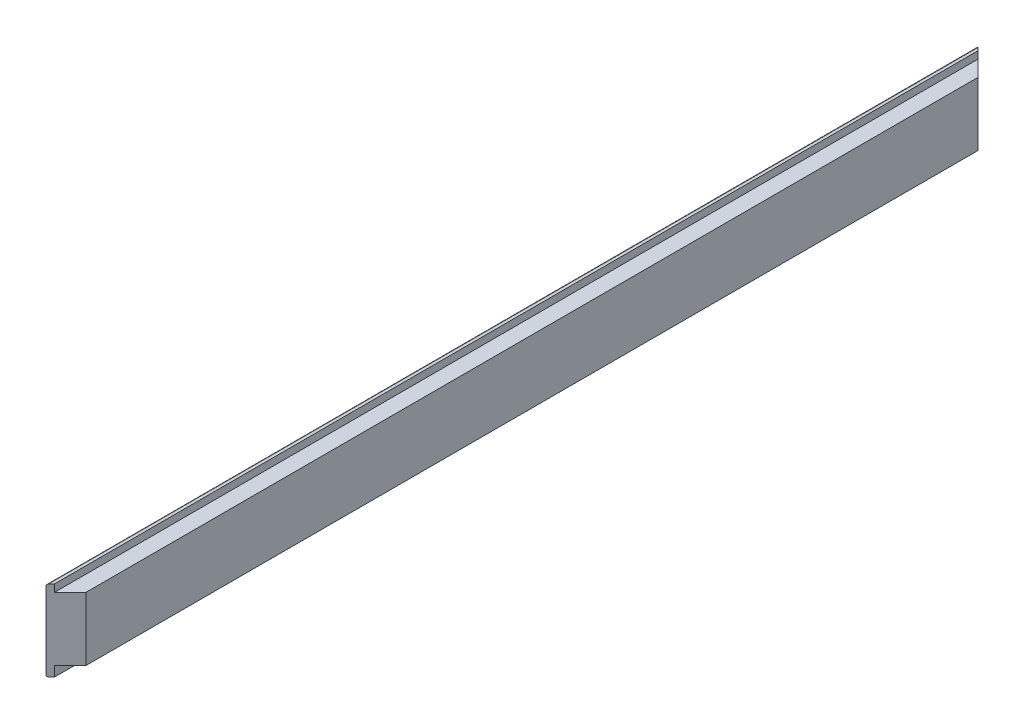
ISO-10303-21;
HEADER;
FILE_DESCRIPTION(('STEP AP214'),'2;1');
FILE_NAME('part.step','',(''),(''),'','','');
FILE_SCHEMA(('AUTOMOTIVE_DESIGN { 1 0 10303 214 1 1 1 1 }'));
ENDSEC;
DATA;
#1=APPLICATION_CONTEXT('core data for automotive mechanical design processes');
#2=APPLICATION_PROTOCOL_DEFINITION('international standard','automotive_design',2000,#1);
#3=PRODUCT_CONTEXT('',#1,'mechanical');
#4=PRODUCT('Part','Part','',(#3));
#5=PRODUCT_RELATED_PRODUCT_CATEGORY('part','',(#4));
#6=PRODUCT_DEFINITION_FORMATION('','',#4);
#7=PRODUCT_DEFINITION_CONTEXT('part definition',#1,'design');
#8=PRODUCT_DEFINITION('design','',#6,#7);
#9=PRODUCT_DEFINITION_SHAPE('','',#8);
#10=(LENGTH_UNIT() NAMED_UNIT(*) SI_UNIT(.MILLI.,.METRE.));
#11=(NAMED_UNIT(*) PLANE_ANGLE_UNIT() SI_UNIT($,.RADIAN.));
#12=(NAMED_UNIT(*) SI_UNIT($,.STERADIAN.) SOLID_ANGLE_UNIT());
#13=UNCERTAINTY_MEASURE_WITH_UNIT(LENGTH_MEASURE(1.E-05),#10,'distance_accuracy_value','');
#14=(GEOMETRIC_REPRESENTATION_CONTEXT(3) GLOBAL_UNCERTAINTY_ASSIGNED_CONTEXT((#13)) GLOBAL_UNIT_ASSIGNED_CONTEXT((#10,
#11,#12)) REPRESENTATION_CONTEXT('',''));
#15=CARTESIAN_POINT('',(0.,0.,0.));
#16=DIRECTION('',(0.,0.,1.));
#17=DIRECTION('',(1.,0.,0.));
#18=AXIS2_PLACEMENT_3D('',#15,#16,#17);
#19=CARTESIAN_POINT('',(0.,0.,444.55));
#20=DIRECTION('',(0.,1.,0.));
#21=DIRECTION('',(-1.,0.,0.));
#22=AXIS2_PLACEMENT_3D('',#19,#20,#21);
#23=PLANE('',#22);
#24=DIRECTION('',(0.,0.,-1.));
#25=VECTOR('',#24,1.);
#26=CARTESIAN_POINT('',(4.05,0.,444.55));
#27=LINE('',#26,#25);
#28=CARTESIAN_POINT('',(4.05,0.,440.5));
#29=VERTEX_POINT('',#28);
#30=CARTESIAN_POINT('',(4.04999999999997,0.,-440.5));
#31=VERTEX_POINT('',#30);
#32=EDGE_CURVE('E210',#29,#31,#27,.T.);
#33=ORIENTED_EDGE('',*,*,#32,.F.);
#34=DIRECTION('',(-0.707106781186547,0.,0.707106781186548));
#35=VECTOR('',#34,1.);
#36=CARTESIAN_POINT('',(0.,0.,444.55));
#37=LINE('',#36,#35);
#38=CARTESIAN_POINT('',(1.5875,0.,442.9625));
#39=VERTEX_POINT('',#38);
#40=EDGE_CURVE('E154',#29,#39,#37,.T.);
#41=ORIENTED_EDGE('',*,*,#40,.T.);
#42=DIRECTION('',(0.,0.,-1.));
#43=VECTOR('',#42,1.);
#44=CARTESIAN_POINT('',(1.5875,0.,-444.55));
#45=LINE('',#44,#43);
#46=CARTESIAN_POINT('',(1.58750000000003,0.,-442.9625));
#47=VERTEX_POINT('',#46);
#48=EDGE_CURVE('E213',#39,#47,#45,.T.);
#49=ORIENTED_EDGE('',*,*,#48,.T.);
#50=DIRECTION('',(0.707106781186547,0.,0.707106781186548));
#51=VECTOR('',#50,1.);
#52=CARTESIAN_POINT('',(0.,0.,-444.55));
#53=LINE('',#52,#51);
#54=EDGE_CURVE('E158',#47,#31,#53,.T.);
#55=ORIENTED_EDGE('',*,*,#54,.T.);
#56=EDGE_LOOP('',(#33,#41,#49,#55));
#57=FACE_BOUND('',#56,.T.);
#58=ADVANCED_FACE('F43',(#57),#23,.F.);
#59=CARTESIAN_POINT('',(4.05,0.,444.55));
#60=DIRECTION('',(-1.,0.,0.));
#61=DIRECTION('',(0.,-1.,0.));
#62=AXIS2_PLACEMENT_3D('',#59,#60,#61);
#63=PLANE('',#62);
#64=DIRECTION('',(0.,0.,-1.));
#65=VECTOR('',#64,1.);
#66=CARTESIAN_POINT('',(4.05,9.525,444.55));
#67=LINE('',#66,#65);
#68=CARTESIAN_POINT('',(4.05,9.525,440.5));
#69=VERTEX_POINT('',#68);
#70=CARTESIAN_POINT('',(4.05,9.525,-440.5));
#71=VERTEX_POINT('',#70);
#72=EDGE_CURVE('E207',#69,#71,#67,.T.);
#73=ORIENTED_EDGE('',*,*,#72,.F.);
#74=DIRECTION('',(0.,-1.,0.));
#75=VECTOR('',#74,1.);
#76=CARTESIAN_POINT('',(4.05,0.,440.5));
#77=LINE('',#76,#75);
#78=EDGE_CURVE('E188',#69,#29,#77,.T.);
#79=ORIENTED_EDGE('',*,*,#78,.T.);
#80=ORIENTED_EDGE('',*,*,#32,.T.);
#81=DIRECTION('',(0.,1.,0.));
#82=VECTOR('',#81,1.);
#83=CARTESIAN_POINT('',(4.05,0.,-440.5));
#84=LINE('',#83,#82);
#85=EDGE_CURVE('E175',#31,#71,#84,.T.);
#86=ORIENTED_EDGE('',*,*,#85,.T.);
#87=EDGE_LOOP('',(#73,#79,#80,#86));
#88=FACE_BOUND('',#87,.T.);
#89=ADVANCED_FACE('F246',(#88),#63,.F.);
#90=CARTESIAN_POINT('',(0.,9.525,444.55));
#91=DIRECTION('',(0.,-1.,0.));
#92=DIRECTION('',(0.,0.,-1.));
#93=AXIS2_PLACEMENT_3D('',#90,#91,#92);
#94=PLANE('',#93);
#95=CARTESIAN_POINT('',(11.55,9.525,410.5));
#96=DIRECTION('',(0.,-1.,0.));
#97=DIRECTION('',(0.,0.,-1.));
#98=AXIS2_PLACEMENT_3D('',#95,#96,#97);
#99=CIRCLE('',#98,3.94999999999999);
#100=CARTESIAN_POINT('',(11.55,9.525,406.55));
#101=VERTEX_POINT('',#100);
#102=EDGE_CURVE('E137',#101,#101,#99,.T.);
#103=ORIENTED_EDGE('',*,*,#102,.F.);
#104=EDGE_LOOP('',(#103));
#105=FACE_BOUND('',#104,.T.);
#106=CARTESIAN_POINT('',(11.55,9.525,-410.5));
#107=DIRECTION('',(0.,-1.,0.));
#108=DIRECTION('',(0.,0.,-1.));
#109=AXIS2_PLACEMENT_3D('',#106,#107,#108);
#110=CIRCLE('',#109,3.94999999999999);
#111=CARTESIAN_POINT('',(11.55,9.525,-414.45));
#112=VERTEX_POINT('',#111);
#113=EDGE_CURVE('E136',#112,#112,#110,.T.);
#114=ORIENTED_EDGE('',*,*,#113,.F.);
#115=EDGE_LOOP('',(#114));
#116=FACE_BOUND('',#115,.T.);
#117=CARTESIAN_POINT('',(11.55,9.525,0.));
#118=DIRECTION('',(0.,-1.,0.));
#119=DIRECTION('',(0.,0.,-1.));
#120=AXIS2_PLACEMENT_3D('',#117,#118,#119);
#121=CIRCLE('',#120,3.94999999999999);
#122=CARTESIAN_POINT('',(11.55,9.525,-3.94999999999999));
#123=VERTEX_POINT('',#122);
#124=EDGE_CURVE('E147',#123,#123,#121,.T.);
#125=ORIENTED_EDGE('',*,*,#124,.F.);
#126=EDGE_LOOP('',(#125));
#127=FACE_BOUND('',#126,.T.);
#128=DIRECTION('',(0.707106781186547,0.,-0.707106781186548));
#129=VECTOR('',#128,1.);
#130=CARTESIAN_POINT('',(0.,9.525,444.55));
#131=LINE('',#130,#129);
#132=CARTESIAN_POINT('',(19.05,9.525,425.5));
#133=VERTEX_POINT('',#132);
#134=EDGE_CURVE('E186',#69,#133,#131,.T.);
#135=ORIENTED_EDGE('',*,*,#134,.F.);
#136=ORIENTED_EDGE('',*,*,#72,.T.);
#137=DIRECTION('',(-0.707106781186547,0.,-0.707106781186548));
#138=VECTOR('',#137,1.);
#139=CARTESIAN_POINT('',(444.55,9.525,1.11022302462516E-13));
#140=LINE('',#139,#138);
#141=CARTESIAN_POINT('',(19.05,9.525,-425.5));
#142=VERTEX_POINT('',#141);
#143=EDGE_CURVE('E173',#142,#71,#140,.T.);
#144=ORIENTED_EDGE('',*,*,#143,.F.);
#145=DIRECTION('',(0.,0.,-1.));
#146=VECTOR('',#145,1.);
#147=CARTESIAN_POINT('',(19.05,9.525,444.55));
#148=LINE('',#147,#146);
#149=EDGE_CURVE('E204',#133,#142,#148,.T.);
#150=ORIENTED_EDGE('',*,*,#149,.F.);
#151=EDGE_LOOP('',(#135,#136,#144,#150));
#152=FACE_BOUND('',#151,.T.);
#153=ADVANCED_FACE('F251',(#105,#116,#127,#152),#94,.T.);
#154=CARTESIAN_POINT('',(19.05,0.,444.55));
#155=DIRECTION('',(-1.,0.,0.));
#156=DIRECTION('',(0.,0.,1.));
#157=AXIS2_PLACEMENT_3D('',#154,#155,#156);
#158=PLANE('',#157);
#159=DIRECTION('',(0.,0.,-1.));
#160=VECTOR('',#159,1.);
#161=CARTESIAN_POINT('',(19.05,70.,444.55));
#162=LINE('',#161,#160);
#163=CARTESIAN_POINT('',(19.05,70.,425.5));
#164=VERTEX_POINT('',#163);
#165=CARTESIAN_POINT('',(19.05,70.,-425.5));
#166=VERTEX_POINT('',#165);
#167=EDGE_CURVE('E201',#164,#166,#162,.T.);
#168=ORIENTED_EDGE('',*,*,#167,.F.);
#169=DIRECTION('',(0.,1.,0.));
#170=VECTOR('',#169,1.);
#171=CARTESIAN_POINT('',(19.05,0.,425.5));
#172=LINE('',#171,#170);
#173=EDGE_CURVE('E157',#133,#164,#172,.T.);
#174=ORIENTED_EDGE('',*,*,#173,.F.);
#175=ORIENTED_EDGE('',*,*,#149,.T.);
#176=DIRECTION('',(0.,1.,0.));
#177=VECTOR('',#176,1.);
#178=CARTESIAN_POINT('',(19.05,0.,-425.5));
#179=LINE('',#178,#177);
#180=EDGE_CURVE('E153',#142,#166,#179,.T.);
#181=ORIENTED_EDGE('',*,*,#180,.T.);
#182=EDGE_LOOP('',(#168,#174,#175,#181));
#183=FACE_BOUND('',#182,.T.);
#184=ADVANCED_FACE('F255',(#183),#158,.F.);
#185=CARTESIAN_POINT('',(0.,70.,444.55));
#186=DIRECTION('',(0.,-1.,0.));
#187=DIRECTION('',(0.,0.,-1.));
#188=AXIS2_PLACEMENT_3D('',#185,#186,#187);
#189=PLANE('',#188);
#190=DIRECTION('',(0.,0.,-1.));
#191=VECTOR('',#190,1.);
#192=CARTESIAN_POINT('',(4.05,70.,444.55));
#193=LINE('',#192,#191);
#194=CARTESIAN_POINT('',(4.05,70.,440.5));
#195=VERTEX_POINT('',#194);
#196=CARTESIAN_POINT('',(4.05,70.,-440.5));
#197=VERTEX_POINT('',#196);
#198=EDGE_CURVE('E198',#195,#197,#193,.T.);
#199=ORIENTED_EDGE('',*,*,#198,.F.);
#200=DIRECTION('',(0.707106781186547,0.,-0.707106781186548));
#201=VECTOR('',#200,1.);
#202=CARTESIAN_POINT('',(0.,70.,444.55));
#203=LINE('',#202,#201);
#204=EDGE_CURVE('E181',#195,#164,#203,.T.);
#205=ORIENTED_EDGE('',*,*,#204,.T.);
#206=ORIENTED_EDGE('',*,*,#167,.T.);
#207=DIRECTION('',(-0.707106781186547,0.,-0.707106781186548));
#208=VECTOR('',#207,1.);
#209=CARTESIAN_POINT('',(444.55,70.,1.11022302462516E-13));
#210=LINE('',#209,#208);
#211=EDGE_CURVE('E168',#166,#197,#210,.T.);
#212=ORIENTED_EDGE('',*,*,#211,.T.);
#213=EDGE_LOOP('',(#199,#205,#206,#212));
#214=FACE_BOUND('',#213,.T.);
#215=ADVANCED_FACE('F259',(#214),#189,.F.);
#216=CARTESIAN_POINT('',(4.04999999999995,0.,444.55));
#217=DIRECTION('',(1.,0.,0.));
#218=DIRECTION('',(0.,1.,0.));
#219=AXIS2_PLACEMENT_3D('',#216,#217,#218);
#220=PLANE('',#219);
#221=DIRECTION('',(0.,1.,0.));
#222=VECTOR('',#221,1.);
#223=CARTESIAN_POINT('',(4.04999999999995,0.,440.5));
#224=LINE('',#223,#222);
#225=CARTESIAN_POINT('',(4.05000000000001,77.,440.5));
#226=VERTEX_POINT('',#225);
#227=EDGE_CURVE('E179',#195,#226,#224,.T.);
#228=ORIENTED_EDGE('',*,*,#227,.F.);
#229=ORIENTED_EDGE('',*,*,#198,.T.);
#230=DIRECTION('',(0.,-1.,0.));
#231=VECTOR('',#230,1.);
#232=CARTESIAN_POINT('',(4.04999999999995,6.54982021000957E-13,-440.5));
#233=LINE('',#232,#231);
#234=CARTESIAN_POINT('',(4.05000000000005,77.,-440.5));
#235=VERTEX_POINT('',#234);
#236=EDGE_CURVE('E166',#235,#197,#233,.T.);
#237=ORIENTED_EDGE('',*,*,#236,.F.);
#238=DIRECTION('',(0.,0.,-1.));
#239=VECTOR('',#238,1.);
#240=CARTESIAN_POINT('',(4.05000000000001,77.,444.55));
#241=LINE('',#240,#239);
#242=EDGE_CURVE('E194',#226,#235,#241,.T.);
#243=ORIENTED_EDGE('',*,*,#242,.F.);
#244=EDGE_LOOP('',(#228,#229,#237,#243));
#245=FACE_BOUND('',#244,.T.);
#246=ADVANCED_FACE('F261',(#245),#220,.T.);
#247=CARTESIAN_POINT('',(0.,77.,444.55));
#248=DIRECTION('',(0.,1.,0.));
#249=DIRECTION('',(0.,0.,1.));
#250=AXIS2_PLACEMENT_3D('',#247,#248,#249);
#251=PLANE('',#250);
#252=DIRECTION('',(-0.707106781186547,0.,0.707106781186548));
#253=VECTOR('',#252,1.);
#254=CARTESIAN_POINT('',(0.,77.,444.55));
#255=LINE('',#254,#253);
#256=CARTESIAN_POINT('',(1.5875,77.,442.9625));
#257=VERTEX_POINT('',#256);
#258=EDGE_CURVE('E57',#226,#257,#255,.T.);
#259=ORIENTED_EDGE('',*,*,#258,.F.);
#260=ORIENTED_EDGE('',*,*,#242,.T.);
#261=DIRECTION('',(0.707106781186547,0.,0.707106781186548));
#262=VECTOR('',#261,1.);
#263=CARTESIAN_POINT('',(444.55,77.,1.11022302462516E-13));
#264=LINE('',#263,#262);
#265=CARTESIAN_POINT('',(1.5875,77.,-442.9625));
#266=VERTEX_POINT('',#265);
#267=EDGE_CURVE('E160',#266,#235,#264,.T.);
#268=ORIENTED_EDGE('',*,*,#267,.F.);
#269=DIRECTION('',(0.,0.,-1.));
#270=VECTOR('',#269,1.);
#271=CARTESIAN_POINT('',(1.5875,77.,444.55));
#272=LINE('',#271,#270);
#273=EDGE_CURVE('E222',#266,#257,#272,.F.);
#274=ORIENTED_EDGE('',*,*,#273,.T.);
#275=EDGE_LOOP('',(#259,#260,#268,#274));
#276=FACE_BOUND('',#275,.T.);
#277=ADVANCED_FACE('F231',(#276),#251,.T.);
#278=CARTESIAN_POINT('',(0.,0.,444.55));
#279=DIRECTION('',(-1.,0.,0.));
#280=DIRECTION('',(0.,0.,1.));
#281=AXIS2_PLACEMENT_3D('',#278,#279,#280);
#282=PLANE('',#281);
#283=DIRECTION('',(0.,1.,0.));
#284=VECTOR('',#283,1.);
#285=CARTESIAN_POINT('',(0.,0.,-444.55));
#286=LINE('',#285,#284);
#287=CARTESIAN_POINT('',(0.,1.5875,-444.55));
#288=VERTEX_POINT('',#287);
#289=CARTESIAN_POINT('',(0.,75.4125,-444.55));
#290=VERTEX_POINT('',#289);
#291=EDGE_CURVE('E65',#288,#290,#286,.T.);
#292=ORIENTED_EDGE('',*,*,#291,.F.);
#293=DIRECTION('',(0.,0.,-1.));
#294=VECTOR('',#293,1.);
#295=CARTESIAN_POINT('',(0.,1.5875,444.55));
#296=LINE('',#295,#294);
#297=CARTESIAN_POINT('',(0.,1.5875,444.55));
#298=VERTEX_POINT('',#297);
#299=EDGE_CURVE('E219',#288,#298,#296,.F.);
#300=ORIENTED_EDGE('',*,*,#299,.T.);
#301=DIRECTION('',(0.,1.,0.));
#302=VECTOR('',#301,1.);
#303=CARTESIAN_POINT('',(0.,0.,444.55));
#304=LINE('',#303,#302);
#305=CARTESIAN_POINT('',(0.,75.4125,444.55));
#306=VERTEX_POINT('',#305);
#307=EDGE_CURVE('E191',#298,#306,#304,.T.);
#308=ORIENTED_EDGE('',*,*,#307,.T.);
#309=DIRECTION('',(0.,0.,-1.));
#310=VECTOR('',#309,1.);
#311=CARTESIAN_POINT('',(0.,75.4125,444.55));
#312=LINE('',#311,#310);
#313=EDGE_CURVE('E216',#306,#290,#312,.T.);
#314=ORIENTED_EDGE('',*,*,#313,.T.);
#315=EDGE_LOOP('',(#292,#300,#308,#314));
#316=FACE_BOUND('',#315,.T.);
#317=ADVANCED_FACE('F236',(#316),#282,.T.);
#318=CARTESIAN_POINT('',(1.5875,1.5875,444.55));
#319=DIRECTION('',(0.,0.,1.));
#320=DIRECTION('',(1.,0.,0.));
#321=AXIS2_PLACEMENT_3D('',#318,#319,#320);
#322=CYLINDRICAL_SURFACE('',#321,1.5875);
#323=CARTESIAN_POINT('',(1.5875,1.5875,442.9625));
#324=DIRECTION('',(-0.707106781186548,0.,-0.707106781186547));
#325=DIRECTION('',(-0.707106781186547,0.,0.707106781186548));
#326=AXIS2_PLACEMENT_3D('',#323,#324,#325);
#327=ELLIPSE('',#326,2.24506403026729,1.5875);
#328=EDGE_CURVE('E184',#298,#39,#327,.F.);
#329=ORIENTED_EDGE('',*,*,#328,.F.);
#330=ORIENTED_EDGE('',*,*,#299,.F.);
#331=CARTESIAN_POINT('',(1.5875,1.5875,-442.9625));
#332=DIRECTION('',(-0.707106781186548,0.,0.707106781186547));
#333=DIRECTION('',(0.707106781186547,0.,0.707106781186548));
#334=AXIS2_PLACEMENT_3D('',#331,#332,#333);
#335=ELLIPSE('',#334,2.24506403026729,1.5875);
#336=EDGE_CURVE('E171',#47,#288,#335,.F.);
#337=ORIENTED_EDGE('',*,*,#336,.F.);
#338=ORIENTED_EDGE('',*,*,#48,.F.);
#339=EDGE_LOOP('',(#329,#330,#337,#338));
#340=FACE_BOUND('',#339,.T.);
#341=ADVANCED_FACE('F240',(#340),#322,.T.);
#342=CARTESIAN_POINT('',(1.5875,75.4125,444.55));
#343=DIRECTION('',(0.,0.,-1.));
#344=DIRECTION('',(-1.,0.,0.));
#345=AXIS2_PLACEMENT_3D('',#342,#343,#344);
#346=CYLINDRICAL_SURFACE('',#345,1.5875);
#347=CARTESIAN_POINT('',(1.5875,75.4125,442.9625));
#348=DIRECTION('',(-0.707106781186548,0.,-0.707106781186547));
#349=DIRECTION('',(0.707106781186547,0.,-0.707106781186548));
#350=AXIS2_PLACEMENT_3D('',#347,#348,#349);
#351=ELLIPSE('',#350,2.24506403026729,1.5875);
#352=EDGE_CURVE('E11',#257,#306,#351,.F.);
#353=ORIENTED_EDGE('',*,*,#352,.F.);
#354=ORIENTED_EDGE('',*,*,#273,.F.);
#355=CARTESIAN_POINT('',(1.5875,75.4125,-442.9625));
#356=DIRECTION('',(-0.707106781186548,0.,0.707106781186547));
#357=DIRECTION('',(-0.707106781186547,0.,-0.707106781186548));
#358=AXIS2_PLACEMENT_3D('',#355,#356,#357);
#359=ELLIPSE('',#358,2.24506403026729,1.5875);
#360=EDGE_CURVE('E51',#290,#266,#359,.F.);
#361=ORIENTED_EDGE('',*,*,#360,.F.);
#362=ORIENTED_EDGE('',*,*,#313,.F.);
#363=EDGE_LOOP('',(#353,#354,#361,#362));
#364=FACE_BOUND('',#363,.T.);
#365=ADVANCED_FACE('F45',(#364),#346,.T.);
#366=CARTESIAN_POINT('',(0.,0.,-444.55));
#367=DIRECTION('',(-0.707106781186548,0.,0.707106781186547));
#368=DIRECTION('',(0.707106781186547,0.,0.707106781186548));
#369=AXIS2_PLACEMENT_3D('',#366,#367,#368);
#370=PLANE('',#369);
#371=ORIENTED_EDGE('',*,*,#54,.F.);
#372=ORIENTED_EDGE('',*,*,#336,.T.);
#373=ORIENTED_EDGE('',*,*,#291,.T.);
#374=ORIENTED_EDGE('',*,*,#360,.T.);
#375=ORIENTED_EDGE('',*,*,#267,.T.);
#376=ORIENTED_EDGE('',*,*,#236,.T.);
#377=ORIENTED_EDGE('',*,*,#211,.F.);
#378=ORIENTED_EDGE('',*,*,#180,.F.);
#379=ORIENTED_EDGE('',*,*,#143,.T.);
#380=ORIENTED_EDGE('',*,*,#85,.F.);
#381=EDGE_LOOP('',(#371,#372,#373,#374,#375,#376,#377,#378,#379,#380));
#382=FACE_BOUND('',#381,.T.);
#383=ADVANCED_FACE('F225',(#382),#370,.F.);
#384=CARTESIAN_POINT('',(0.,0.,444.55));
#385=DIRECTION('',(-0.707106781186548,0.,-0.707106781186547));
#386=DIRECTION('',(-0.707106781186547,0.,0.707106781186548));
#387=AXIS2_PLACEMENT_3D('',#384,#385,#386);
#388=PLANE('',#387);
#389=ORIENTED_EDGE('',*,*,#134,.T.);
#390=ORIENTED_EDGE('',*,*,#173,.T.);
#391=ORIENTED_EDGE('',*,*,#204,.F.);
#392=ORIENTED_EDGE('',*,*,#227,.T.);
#393=ORIENTED_EDGE('',*,*,#258,.T.);
#394=ORIENTED_EDGE('',*,*,#352,.T.);
#395=ORIENTED_EDGE('',*,*,#307,.F.);
#396=ORIENTED_EDGE('',*,*,#328,.T.);
#397=ORIENTED_EDGE('',*,*,#40,.F.);
#398=ORIENTED_EDGE('',*,*,#78,.F.);
#399=EDGE_LOOP('',(#389,#390,#391,#392,#393,#394,#395,#396,#397,#398));
#400=FACE_BOUND('',#399,.T.);
#401=ADVANCED_FACE('F233',(#400),#388,.F.);
#402=CARTESIAN_POINT('',(11.55,24.525,0.));
#403=DIRECTION('',(0.,-1.,0.));
#404=DIRECTION('',(0.,0.,-1.));
#405=AXIS2_PLACEMENT_3D('',#402,#403,#404);
#406=CONICAL_SURFACE('',#405,3.94999999999999,1.02974425867665);
#407=CARTESIAN_POINT('',(11.55,26.8983994451589,0.));
#408=VERTEX_POINT('',#407);
#409=VERTEX_LOOP('',#408);
#410=FACE_BOUND('',#409,.T.);
#411=CARTESIAN_POINT('',(11.55,24.525,0.));
#412=DIRECTION('',(0.,-1.,0.));
#413=DIRECTION('',(0.,0.,-1.));
#414=AXIS2_PLACEMENT_3D('',#411,#412,#413);
#415=CIRCLE('',#414,3.94999999999999);
#416=CARTESIAN_POINT('',(11.55,24.525,-3.94999999999999));
#417=VERTEX_POINT('',#416);
#418=EDGE_CURVE('E150',#417,#417,#415,.T.);
#419=ORIENTED_EDGE('',*,*,#418,.T.);
#420=EDGE_LOOP('',(#419));
#421=FACE_BOUND('',#420,.T.);
#422=ADVANCED_FACE('F290',(#410,#421),#406,.F.);
#423=CARTESIAN_POINT('',(11.55,9.525,0.));
#424=DIRECTION('',(0.,-1.,0.));
#425=DIRECTION('',(0.,0.,-1.));
#426=AXIS2_PLACEMENT_3D('',#423,#424,#425);
#427=CYLINDRICAL_SURFACE('',#426,3.94999999999999);
#428=ORIENTED_EDGE('',*,*,#418,.F.);
#429=EDGE_LOOP('',(#428));
#430=FACE_BOUND('',#429,.T.);
#431=ORIENTED_EDGE('',*,*,#124,.T.);
#432=EDGE_LOOP('',(#431));
#433=FACE_BOUND('',#432,.T.);
#434=ADVANCED_FACE('F293',(#430,#433),#427,.F.);
#435=CARTESIAN_POINT('',(11.55,24.525,-410.5));
#436=DIRECTION('',(0.,-1.,0.));
#437=DIRECTION('',(0.,0.,-1.));
#438=AXIS2_PLACEMENT_3D('',#435,#436,#437);
#439=CONICAL_SURFACE('',#438,3.94999999999999,1.02974425867665);
#440=CARTESIAN_POINT('',(11.55,26.8983994451589,-410.5));
#441=VERTEX_POINT('',#440);
#442=VERTEX_LOOP('',#441);
#443=FACE_BOUND('',#442,.T.);
#444=CARTESIAN_POINT('',(11.55,24.525,-410.5));
#445=DIRECTION('',(0.,-1.,0.));
#446=DIRECTION('',(0.,0.,-1.));
#447=AXIS2_PLACEMENT_3D('',#444,#445,#446);
#448=CIRCLE('',#447,3.94999999999999);
#449=CARTESIAN_POINT('',(11.55,24.525,-414.45));
#450=VERTEX_POINT('',#449);
#451=EDGE_CURVE('E140',#450,#450,#448,.T.);
#452=ORIENTED_EDGE('',*,*,#451,.T.);
#453=EDGE_LOOP('',(#452));
#454=FACE_BOUND('',#453,.T.);
#455=ADVANCED_FACE('F297',(#443,#454),#439,.F.);
#456=CARTESIAN_POINT('',(11.55,9.525,-410.5));
#457=DIRECTION('',(0.,-1.,0.));
#458=DIRECTION('',(0.,0.,-1.));
#459=AXIS2_PLACEMENT_3D('',#456,#457,#458);
#460=CYLINDRICAL_SURFACE('',#459,3.94999999999999);
#461=ORIENTED_EDGE('',*,*,#451,.F.);
#462=EDGE_LOOP('',(#461));
#463=FACE_BOUND('',#462,.T.);
#464=ORIENTED_EDGE('',*,*,#113,.T.);
#465=EDGE_LOOP('',(#464));
#466=FACE_BOUND('',#465,.T.);
#467=ADVANCED_FACE('F130',(#463,#466),#460,.F.);
#468=CARTESIAN_POINT('',(11.55,24.525,410.5));
#469=DIRECTION('',(0.,-1.,0.));
#470=DIRECTION('',(0.,0.,-1.));
#471=AXIS2_PLACEMENT_3D('',#468,#469,#470);
#472=CONICAL_SURFACE('',#471,3.94999999999999,1.02974425867665);
#473=CARTESIAN_POINT('',(11.55,26.8983994451589,410.5));
#474=VERTEX_POINT('',#473);
#475=VERTEX_LOOP('',#474);
#476=FACE_BOUND('',#475,.T.);
#477=CARTESIAN_POINT('',(11.55,24.525,410.5));
#478=DIRECTION('',(0.,-1.,0.));
#479=DIRECTION('',(0.,0.,-1.));
#480=AXIS2_PLACEMENT_3D('',#477,#478,#479);
#481=CIRCLE('',#480,3.94999999999999);
#482=CARTESIAN_POINT('',(11.55,24.525,406.55));
#483=VERTEX_POINT('',#482);
#484=EDGE_CURVE('E134',#483,#483,#481,.T.);
#485=ORIENTED_EDGE('',*,*,#484,.T.);
#486=EDGE_LOOP('',(#485));
#487=FACE_BOUND('',#486,.T.);
#488=ADVANCED_FACE('F126',(#476,#487),#472,.F.);
#489=CARTESIAN_POINT('',(11.55,9.525,410.5));
#490=DIRECTION('',(0.,-1.,0.));
#491=DIRECTION('',(0.,0.,-1.));
#492=AXIS2_PLACEMENT_3D('',#489,#490,#491);
#493=CYLINDRICAL_SURFACE('',#492,3.94999999999999);
#494=ORIENTED_EDGE('',*,*,#484,.F.);
#495=EDGE_LOOP('',(#494));
#496=FACE_BOUND('',#495,.T.);
#497=ORIENTED_EDGE('',*,*,#102,.T.);
#498=EDGE_LOOP('',(#497));
#499=FACE_BOUND('',#498,.T.);
#500=ADVANCED_FACE('F129',(#496,#499),#493,.F.);
#501=CLOSED_SHELL('',(#58,#89,#153,#184,#215,#246,#277,#317,#341,#365,#383,#401,#422,#434,#455,
#467,#488,#500));
#502=MANIFOLD_SOLID_BREP('B2',#501);
#503=ADVANCED_BREP_SHAPE_REPRESENTATION('',(#18,#502),#14);
#504=SHAPE_DEFINITION_REPRESENTATION(#9,#503);
ENDSEC;
END-ISO-10303-21;
